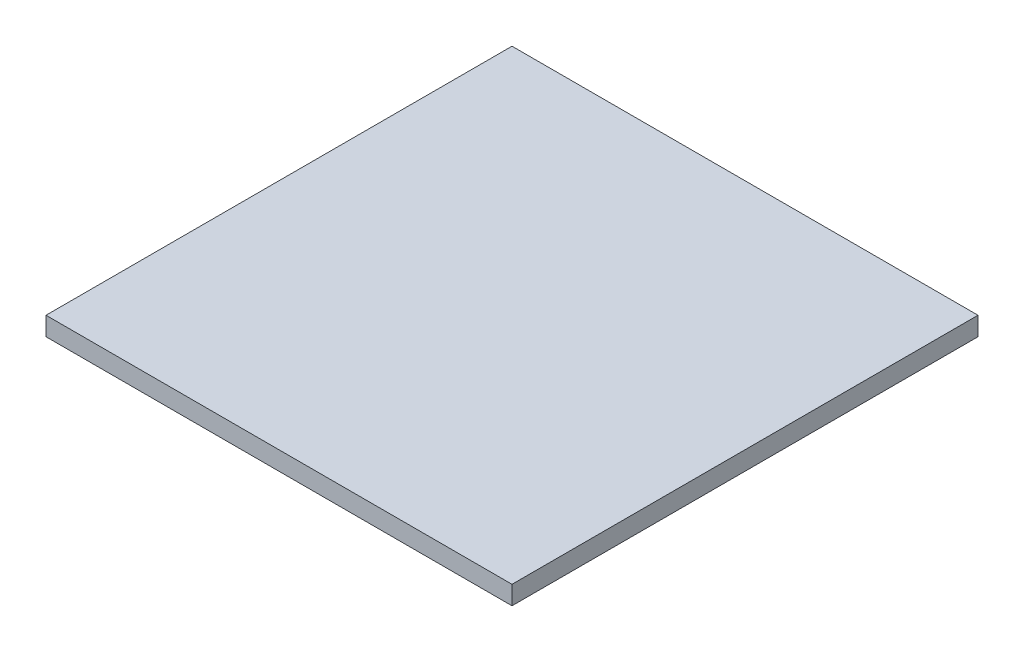
ISO-10303-21;
HEADER;
FILE_DESCRIPTION(('STEP AP214'),'2;1');
FILE_NAME('part.step','',(''),(''),'','','');
FILE_SCHEMA(('AUTOMOTIVE_DESIGN { 1 0 10303 214 1 1 1 1 }'));
ENDSEC;
DATA;
#1=APPLICATION_CONTEXT('core data for automotive mechanical design processes');
#2=APPLICATION_PROTOCOL_DEFINITION('international standard','automotive_design',2000,#1);
#3=PRODUCT_CONTEXT('',#1,'mechanical');
#4=PRODUCT('Part','Part','',(#3));
#5=PRODUCT_RELATED_PRODUCT_CATEGORY('part','',(#4));
#6=PRODUCT_DEFINITION_FORMATION('','',#4);
#7=PRODUCT_DEFINITION_CONTEXT('part definition',#1,'design');
#8=PRODUCT_DEFINITION('design','',#6,#7);
#9=PRODUCT_DEFINITION_SHAPE('','',#8);
#10=(LENGTH_UNIT() NAMED_UNIT(*) SI_UNIT(.MILLI.,.METRE.));
#11=(NAMED_UNIT(*) PLANE_ANGLE_UNIT() SI_UNIT($,.RADIAN.));
#12=(NAMED_UNIT(*) SI_UNIT($,.STERADIAN.) SOLID_ANGLE_UNIT());
#13=UNCERTAINTY_MEASURE_WITH_UNIT(LENGTH_MEASURE(1.E-05),#10,'distance_accuracy_value','');
#14=(GEOMETRIC_REPRESENTATION_CONTEXT(3) GLOBAL_UNCERTAINTY_ASSIGNED_CONTEXT((#13)) GLOBAL_UNIT_ASSIGNED_CONTEXT((#10,
#11,#12)) REPRESENTATION_CONTEXT('',''));
#15=CARTESIAN_POINT('',(0.,0.,0.));
#16=DIRECTION('',(0.,0.,1.));
#17=DIRECTION('',(1.,0.,0.));
#18=AXIS2_PLACEMENT_3D('',#15,#16,#17);
#19=CARTESIAN_POINT('',(0.,5.99999999999995,0.));
#20=DIRECTION('',(1.,0.,0.));
#21=DIRECTION('',(0.,0.,-1.));
#22=AXIS2_PLACEMENT_3D('',#19,#20,#21);
#23=PLANE('',#22);
#24=DIRECTION('',(0.,0.,1.));
#25=VECTOR('',#24,1.);
#26=CARTESIAN_POINT('',(0.,0.,0.));
#27=LINE('',#26,#25);
#28=CARTESIAN_POINT('',(0.,0.,-150.));
#29=VERTEX_POINT('',#28);
#30=CARTESIAN_POINT('',(0.,0.,0.));
#31=VERTEX_POINT('',#30);
#32=EDGE_CURVE('E95',#29,#31,#27,.T.);
#33=ORIENTED_EDGE('',*,*,#32,.T.);
#34=DIRECTION('',(0.,-1.,0.));
#35=VECTOR('',#34,1.);
#36=CARTESIAN_POINT('',(0.,5.99999999999995,0.));
#37=LINE('',#36,#35);
#38=CARTESIAN_POINT('',(0.,5.99999999999995,0.));
#39=VERTEX_POINT('',#38);
#40=EDGE_CURVE('E11',#39,#31,#37,.T.);
#41=ORIENTED_EDGE('',*,*,#40,.F.);
#42=DIRECTION('',(0.,0.,1.));
#43=VECTOR('',#42,1.);
#44=CARTESIAN_POINT('',(0.,5.99999999999995,0.));
#45=LINE('',#44,#43);
#46=CARTESIAN_POINT('',(0.,5.99999999999995,-150.));
#47=VERTEX_POINT('',#46);
#48=EDGE_CURVE('E83',#47,#39,#45,.T.);
#49=ORIENTED_EDGE('',*,*,#48,.F.);
#50=DIRECTION('',(0.,-1.,0.));
#51=VECTOR('',#50,1.);
#52=CARTESIAN_POINT('',(0.,5.99999999999995,-150.));
#53=LINE('',#52,#51);
#54=EDGE_CURVE('E91',#47,#29,#53,.T.);
#55=ORIENTED_EDGE('',*,*,#54,.T.);
#56=EDGE_LOOP('',(#33,#41,#49,#55));
#57=FACE_BOUND('',#56,.T.);
#58=ADVANCED_FACE('F32',(#57),#23,.F.);
#59=CARTESIAN_POINT('',(0.,5.99999999999995,0.));
#60=DIRECTION('',(0.,0.,-1.));
#61=DIRECTION('',(-1.,0.,0.));
#62=AXIS2_PLACEMENT_3D('',#59,#60,#61);
#63=PLANE('',#62);
#64=DIRECTION('',(1.,0.,0.));
#65=VECTOR('',#64,1.);
#66=CARTESIAN_POINT('',(0.,0.,0.));
#67=LINE('',#66,#65);
#68=CARTESIAN_POINT('',(150.,0.,0.));
#69=VERTEX_POINT('',#68);
#70=EDGE_CURVE('E87',#31,#69,#67,.T.);
#71=ORIENTED_EDGE('',*,*,#70,.T.);
#72=DIRECTION('',(0.,-1.,0.));
#73=VECTOR('',#72,1.);
#74=CARTESIAN_POINT('',(150.,5.99999999999995,0.));
#75=LINE('',#74,#73);
#76=CARTESIAN_POINT('',(150.,5.99999999999995,0.));
#77=VERTEX_POINT('',#76);
#78=EDGE_CURVE('E40',#77,#69,#75,.T.);
#79=ORIENTED_EDGE('',*,*,#78,.F.);
#80=DIRECTION('',(1.,0.,0.));
#81=VECTOR('',#80,1.);
#82=CARTESIAN_POINT('',(0.,5.99999999999995,0.));
#83=LINE('',#82,#81);
#84=EDGE_CURVE('E78',#39,#77,#83,.T.);
#85=ORIENTED_EDGE('',*,*,#84,.F.);
#86=ORIENTED_EDGE('',*,*,#40,.T.);
#87=EDGE_LOOP('',(#71,#79,#85,#86));
#88=FACE_BOUND('',#87,.T.);
#89=ADVANCED_FACE('F86',(#88),#63,.F.);
#90=CARTESIAN_POINT('',(150.,5.99999999999995,0.));
#91=DIRECTION('',(-1.,0.,0.));
#92=DIRECTION('',(0.,0.,1.));
#93=AXIS2_PLACEMENT_3D('',#90,#91,#92);
#94=PLANE('',#93);
#95=DIRECTION('',(0.,0.,-1.));
#96=VECTOR('',#95,1.);
#97=CARTESIAN_POINT('',(150.,0.,0.));
#98=LINE('',#97,#96);
#99=CARTESIAN_POINT('',(150.,0.,-150.));
#100=VERTEX_POINT('',#99);
#101=EDGE_CURVE('E65',#69,#100,#98,.T.);
#102=ORIENTED_EDGE('',*,*,#101,.T.);
#103=DIRECTION('',(0.,-1.,0.));
#104=VECTOR('',#103,1.);
#105=CARTESIAN_POINT('',(150.,5.99999999999995,-150.));
#106=LINE('',#105,#104);
#107=CARTESIAN_POINT('',(150.,5.99999999999995,-150.));
#108=VERTEX_POINT('',#107);
#109=EDGE_CURVE('E88',#108,#100,#106,.T.);
#110=ORIENTED_EDGE('',*,*,#109,.F.);
#111=DIRECTION('',(0.,0.,-1.));
#112=VECTOR('',#111,1.);
#113=CARTESIAN_POINT('',(150.,5.99999999999995,0.));
#114=LINE('',#113,#112);
#115=EDGE_CURVE('E81',#77,#108,#114,.T.);
#116=ORIENTED_EDGE('',*,*,#115,.F.);
#117=ORIENTED_EDGE('',*,*,#78,.T.);
#118=EDGE_LOOP('',(#102,#110,#116,#117));
#119=FACE_BOUND('',#118,.T.);
#120=ADVANCED_FACE('F89',(#119),#94,.F.);
#121=CARTESIAN_POINT('',(0.,5.99999999999995,-150.));
#122=DIRECTION('',(0.,0.,1.));
#123=DIRECTION('',(1.,0.,0.));
#124=AXIS2_PLACEMENT_3D('',#121,#122,#123);
#125=PLANE('',#124);
#126=DIRECTION('',(-1.,0.,0.));
#127=VECTOR('',#126,1.);
#128=CARTESIAN_POINT('',(0.,0.,-150.));
#129=LINE('',#128,#127);
#130=EDGE_CURVE('E71',#100,#29,#129,.T.);
#131=ORIENTED_EDGE('',*,*,#130,.T.);
#132=ORIENTED_EDGE('',*,*,#54,.F.);
#133=DIRECTION('',(-1.,0.,0.));
#134=VECTOR('',#133,1.);
#135=CARTESIAN_POINT('',(0.,5.99999999999995,-150.));
#136=LINE('',#135,#134);
#137=EDGE_CURVE('E48',#108,#47,#136,.T.);
#138=ORIENTED_EDGE('',*,*,#137,.F.);
#139=ORIENTED_EDGE('',*,*,#109,.T.);
#140=EDGE_LOOP('',(#131,#132,#138,#139));
#141=FACE_BOUND('',#140,.T.);
#142=ADVANCED_FACE('F102',(#141),#125,.F.);
#143=CARTESIAN_POINT('',(0.,5.99999999999995,0.));
#144=DIRECTION('',(0.,-1.,0.));
#145=DIRECTION('',(0.,0.,-1.));
#146=AXIS2_PLACEMENT_3D('',#143,#144,#145);
#147=PLANE('',#146);
#148=ORIENTED_EDGE('',*,*,#48,.T.);
#149=ORIENTED_EDGE('',*,*,#84,.T.);
#150=ORIENTED_EDGE('',*,*,#115,.T.);
#151=ORIENTED_EDGE('',*,*,#137,.T.);
#152=EDGE_LOOP('',(#148,#149,#150,#151));
#153=FACE_BOUND('',#152,.T.);
#154=ADVANCED_FACE('F79',(#153),#147,.F.);
#155=CARTESIAN_POINT('',(0.,0.,0.));
#156=DIRECTION('',(0.,-1.,0.));
#157=DIRECTION('',(0.,0.,-1.));
#158=AXIS2_PLACEMENT_3D('',#155,#156,#157);
#159=PLANE('',#158);
#160=ORIENTED_EDGE('',*,*,#32,.F.);
#161=ORIENTED_EDGE('',*,*,#130,.F.);
#162=ORIENTED_EDGE('',*,*,#101,.F.);
#163=ORIENTED_EDGE('',*,*,#70,.F.);
#164=EDGE_LOOP('',(#160,#161,#162,#163));
#165=FACE_BOUND('',#164,.T.);
#166=ADVANCED_FACE('F105',(#165),#159,.T.);
#167=CLOSED_SHELL('',(#58,#89,#120,#142,#154,#166));
#168=MANIFOLD_SOLID_BREP('B2',#167);
#169=ADVANCED_BREP_SHAPE_REPRESENTATION('',(#18,#168),#14);
#170=SHAPE_DEFINITION_REPRESENTATION(#9,#169);
ENDSEC;
END-ISO-10303-21;
